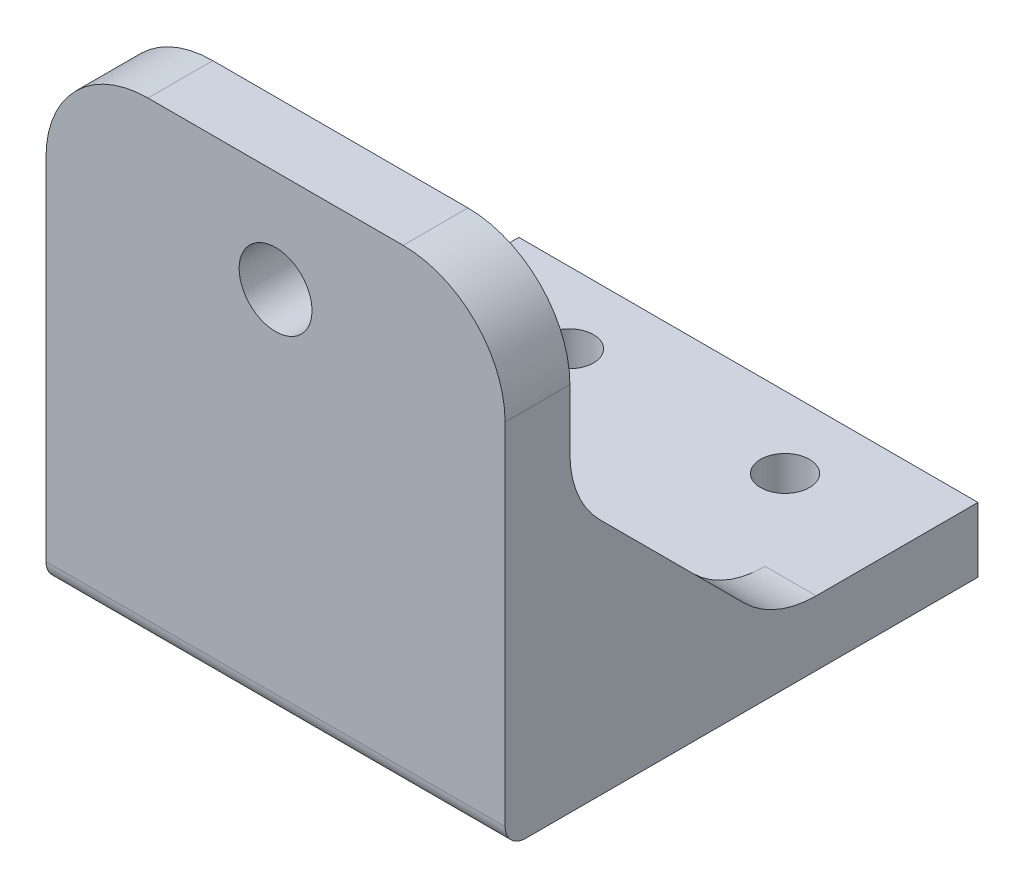
ISO-10303-21;
HEADER;
FILE_DESCRIPTION(('STEP AP214'),'2;1');
FILE_NAME('part.step','',(''),(''),'','','');
FILE_SCHEMA(('AUTOMOTIVE_DESIGN { 1 0 10303 214 1 1 1 1 }'));
ENDSEC;
DATA;
#1=APPLICATION_CONTEXT('core data for automotive mechanical design processes');
#2=APPLICATION_PROTOCOL_DEFINITION('international standard','automotive_design',2000,#1);
#3=PRODUCT_CONTEXT('',#1,'mechanical');
#4=PRODUCT('Part','Part','',(#3));
#5=PRODUCT_RELATED_PRODUCT_CATEGORY('part','',(#4));
#6=PRODUCT_DEFINITION_FORMATION('','',#4);
#7=PRODUCT_DEFINITION_CONTEXT('part definition',#1,'design');
#8=PRODUCT_DEFINITION('design','',#6,#7);
#9=PRODUCT_DEFINITION_SHAPE('','',#8);
#10=(LENGTH_UNIT() NAMED_UNIT(*) SI_UNIT(.MILLI.,.METRE.));
#11=(NAMED_UNIT(*) PLANE_ANGLE_UNIT() SI_UNIT($,.RADIAN.));
#12=(NAMED_UNIT(*) SI_UNIT($,.STERADIAN.) SOLID_ANGLE_UNIT());
#13=UNCERTAINTY_MEASURE_WITH_UNIT(LENGTH_MEASURE(1.E-05),#10,'distance_accuracy_value','');
#14=(GEOMETRIC_REPRESENTATION_CONTEXT(3) GLOBAL_UNCERTAINTY_ASSIGNED_CONTEXT((#13)) GLOBAL_UNIT_ASSIGNED_CONTEXT((#10,
#11,#12)) REPRESENTATION_CONTEXT('',''));
#15=CARTESIAN_POINT('',(0.,0.,0.));
#16=DIRECTION('',(0.,0.,1.));
#17=DIRECTION('',(1.,0.,0.));
#18=AXIS2_PLACEMENT_3D('',#15,#16,#17);
#19=CARTESIAN_POINT('',(0.,6.35,0.));
#20=DIRECTION('',(0.,1.,0.));
#21=DIRECTION('',(0.,0.,1.));
#22=AXIS2_PLACEMENT_3D('',#19,#20,#21);
#23=PLANE('',#22);
#24=CARTESIAN_POINT('',(-10.58478565,6.35,44.5));
#25=DIRECTION('',(0.,1.,0.));
#26=DIRECTION('',(0.,0.,1.));
#27=AXIS2_PLACEMENT_3D('',#24,#25,#26);
#28=CIRCLE('',#27,2.39999999999999);
#29=CARTESIAN_POINT('',(-10.58478565,6.35,46.9));
#30=VERTEX_POINT('',#29);
#31=EDGE_CURVE('E420',#30,#30,#28,.T.);
#32=ORIENTED_EDGE('',*,*,#31,.F.);
#33=EDGE_LOOP('',(#32));
#34=FACE_BOUND('',#33,.T.);
#35=CARTESIAN_POINT('',(10.58478565,6.35,44.5));
#36=DIRECTION('',(0.,1.,0.));
#37=DIRECTION('',(0.,0.,1.));
#38=AXIS2_PLACEMENT_3D('',#35,#36,#37);
#39=CIRCLE('',#38,2.39999999999999);
#40=CARTESIAN_POINT('',(10.58478565,6.35,46.9));
#41=VERTEX_POINT('',#40);
#42=EDGE_CURVE('E357',#41,#41,#39,.T.);
#43=ORIENTED_EDGE('',*,*,#42,.F.);
#44=EDGE_LOOP('',(#43));
#45=FACE_BOUND('',#44,.T.);
#46=DIRECTION('',(0.,0.,1.));
#47=VECTOR('',#46,1.);
#48=CARTESIAN_POINT('',(17.5,6.35,57.5));
#49=LINE('',#48,#47);
#50=CARTESIAN_POINT('',(17.5,6.35,53.357864376269));
#51=VERTEX_POINT('',#50);
#52=CARTESIAN_POINT('',(17.5,6.35,75.5));
#53=VERTEX_POINT('',#52);
#54=EDGE_CURVE('E168',#51,#53,#49,.T.);
#55=ORIENTED_EDGE('',*,*,#54,.F.);
#56=DIRECTION('',(1.,0.,0.));
#57=VECTOR('',#56,1.);
#58=CARTESIAN_POINT('',(0.,6.35,53.357864376269));
#59=LINE('',#58,#57);
#60=CARTESIAN_POINT('',(22.5,6.35,53.357864376269));
#61=VERTEX_POINT('',#60);
#62=EDGE_CURVE('E174',#51,#61,#59,.T.);
#63=ORIENTED_EDGE('',*,*,#62,.T.);
#64=DIRECTION('',(0.,0.,-1.));
#65=VECTOR('',#64,1.);
#66=CARTESIAN_POINT('',(22.5,6.35,77.5));
#67=LINE('',#66,#65);
#68=CARTESIAN_POINT('',(22.5,6.35,37.5));
#69=VERTEX_POINT('',#68);
#70=EDGE_CURVE('E259',#61,#69,#67,.T.);
#71=ORIENTED_EDGE('',*,*,#70,.T.);
#72=DIRECTION('',(-1.,0.,0.));
#73=VECTOR('',#72,1.);
#74=CARTESIAN_POINT('',(0.,6.35,37.5));
#75=LINE('',#74,#73);
#76=CARTESIAN_POINT('',(-22.5,6.35,37.5));
#77=VERTEX_POINT('',#76);
#78=EDGE_CURVE('E351',#69,#77,#75,.T.);
#79=ORIENTED_EDGE('',*,*,#78,.T.);
#80=DIRECTION('',(0.,0.,1.));
#81=VECTOR('',#80,1.);
#82=CARTESIAN_POINT('',(-22.5,6.35,77.5));
#83=LINE('',#82,#81);
#84=CARTESIAN_POINT('',(-22.5,6.35,53.357864376269));
#85=VERTEX_POINT('',#84);
#86=EDGE_CURVE('E268',#77,#85,#83,.T.);
#87=ORIENTED_EDGE('',*,*,#86,.T.);
#88=DIRECTION('',(-1.,0.,0.));
#89=VECTOR('',#88,1.);
#90=CARTESIAN_POINT('',(-17.5,6.35,53.357864376269));
#91=LINE('',#90,#89);
#92=CARTESIAN_POINT('',(-17.5,6.35,53.357864376269));
#93=VERTEX_POINT('',#92);
#94=EDGE_CURVE('E210',#85,#93,#91,.F.);
#95=ORIENTED_EDGE('',*,*,#94,.T.);
#96=DIRECTION('',(0.,0.,1.));
#97=VECTOR('',#96,1.);
#98=CARTESIAN_POINT('',(-17.5,6.35,57.5));
#99=LINE('',#98,#97);
#100=CARTESIAN_POINT('',(-17.5,6.35,75.5));
#101=VERTEX_POINT('',#100);
#102=EDGE_CURVE('E405',#93,#101,#99,.T.);
#103=ORIENTED_EDGE('',*,*,#102,.T.);
#104=DIRECTION('',(1.,0.,0.));
#105=VECTOR('',#104,1.);
#106=CARTESIAN_POINT('',(0.,6.35,75.5));
#107=LINE('',#106,#105);
#108=EDGE_CURVE('E192',#101,#53,#107,.T.);
#109=ORIENTED_EDGE('',*,*,#108,.T.);
#110=EDGE_LOOP('',(#55,#63,#71,#79,#87,#95,#103,#109));
#111=FACE_BOUND('',#110,.T.);
#112=ADVANCED_FACE('F43',(#34,#45,#111),#23,.T.);
#113=CARTESIAN_POINT('',(0.,0.,77.5));
#114=DIRECTION('',(0.,0.,1.));
#115=DIRECTION('',(1.,0.,0.));
#116=AXIS2_PLACEMENT_3D('',#113,#114,#115);
#117=PLANE('',#116);
#118=CARTESIAN_POINT('',(0.,36.35,77.5));
#119=DIRECTION('',(0.,0.,-1.));
#120=DIRECTION('',(-1.,0.,0.));
#121=AXIS2_PLACEMENT_3D('',#118,#119,#120);
#122=CIRCLE('',#121,4.20624);
#123=CARTESIAN_POINT('',(-4.20624,36.35,77.5));
#124=VERTEX_POINT('',#123);
#125=EDGE_CURVE('E355',#124,#124,#122,.T.);
#126=ORIENTED_EDGE('',*,*,#125,.F.);
#127=EDGE_LOOP('',(#126));
#128=FACE_BOUND('',#127,.T.);
#129=DIRECTION('',(0.,1.,0.));
#130=VECTOR('',#129,1.);
#131=CARTESIAN_POINT('',(22.5,0.,77.5));
#132=LINE('',#131,#130);
#133=CARTESIAN_POINT('',(22.5,30.492135623731,77.5));
#134=VERTEX_POINT('',#133);
#135=CARTESIAN_POINT('',(22.5,36.35,77.5));
#136=VERTEX_POINT('',#135);
#137=EDGE_CURVE('E372',#134,#136,#132,.T.);
#138=ORIENTED_EDGE('',*,*,#137,.F.);
#139=DIRECTION('',(1.,0.,0.));
#140=VECTOR('',#139,1.);
#141=CARTESIAN_POINT('',(17.5,30.492135623731,77.5));
#142=LINE('',#141,#140);
#143=CARTESIAN_POINT('',(17.5,30.492135623731,77.5));
#144=VERTEX_POINT('',#143);
#145=EDGE_CURVE('E182',#134,#144,#142,.F.);
#146=ORIENTED_EDGE('',*,*,#145,.T.);
#147=DIRECTION('',(0.,1.,0.));
#148=VECTOR('',#147,1.);
#149=CARTESIAN_POINT('',(17.5,6.35,77.5));
#150=LINE('',#149,#148);
#151=CARTESIAN_POINT('',(17.5,8.35,77.5));
#152=VERTEX_POINT('',#151);
#153=EDGE_CURVE('E58',#152,#144,#150,.T.);
#154=ORIENTED_EDGE('',*,*,#153,.F.);
#155=DIRECTION('',(1.,0.,0.));
#156=VECTOR('',#155,1.);
#157=CARTESIAN_POINT('',(0.,8.35,77.5));
#158=LINE('',#157,#156);
#159=CARTESIAN_POINT('',(-17.5,8.35,77.5));
#160=VERTEX_POINT('',#159);
#161=EDGE_CURVE('E179',#152,#160,#158,.F.);
#162=ORIENTED_EDGE('',*,*,#161,.T.);
#163=DIRECTION('',(0.,1.,0.));
#164=VECTOR('',#163,1.);
#165=CARTESIAN_POINT('',(-17.5,6.35,77.5));
#166=LINE('',#165,#164);
#167=CARTESIAN_POINT('',(-17.5,30.492135623731,77.5));
#168=VERTEX_POINT('',#167);
#169=EDGE_CURVE('E389',#160,#168,#166,.T.);
#170=ORIENTED_EDGE('',*,*,#169,.T.);
#171=DIRECTION('',(-1.,0.,0.));
#172=VECTOR('',#171,1.);
#173=CARTESIAN_POINT('',(0.,30.492135623731,77.5));
#174=LINE('',#173,#172);
#175=CARTESIAN_POINT('',(-22.5,30.492135623731,77.5));
#176=VERTEX_POINT('',#175);
#177=EDGE_CURVE('E214',#168,#176,#174,.T.);
#178=ORIENTED_EDGE('',*,*,#177,.T.);
#179=DIRECTION('',(0.,-1.,0.));
#180=VECTOR('',#179,1.);
#181=CARTESIAN_POINT('',(-22.5,0.,77.5));
#182=LINE('',#181,#180);
#183=CARTESIAN_POINT('',(-22.5,36.35,77.5));
#184=VERTEX_POINT('',#183);
#185=EDGE_CURVE('E375',#184,#176,#182,.T.);
#186=ORIENTED_EDGE('',*,*,#185,.F.);
#187=CARTESIAN_POINT('',(-12.5,36.35,77.5));
#188=DIRECTION('',(0.,0.,1.));
#189=DIRECTION('',(1.,0.,0.));
#190=AXIS2_PLACEMENT_3D('',#187,#188,#189);
#191=CIRCLE('',#190,10.);
#192=CARTESIAN_POINT('',(-12.5,46.35,77.5));
#193=VERTEX_POINT('',#192);
#194=EDGE_CURVE('E289',#184,#193,#191,.F.);
#195=ORIENTED_EDGE('',*,*,#194,.T.);
#196=DIRECTION('',(-1.,0.,0.));
#197=VECTOR('',#196,1.);
#198=CARTESIAN_POINT('',(22.5,46.35,77.5));
#199=LINE('',#198,#197);
#200=CARTESIAN_POINT('',(12.5,46.35,77.5));
#201=VERTEX_POINT('',#200);
#202=EDGE_CURVE('E380',#201,#193,#199,.T.);
#203=ORIENTED_EDGE('',*,*,#202,.F.);
#204=CARTESIAN_POINT('',(12.5,36.35,77.5));
#205=DIRECTION('',(0.,0.,1.));
#206=DIRECTION('',(1.,0.,0.));
#207=AXIS2_PLACEMENT_3D('',#204,#205,#206);
#208=CIRCLE('',#207,10.);
#209=EDGE_CURVE('E273',#201,#136,#208,.F.);
#210=ORIENTED_EDGE('',*,*,#209,.T.);
#211=EDGE_LOOP('',(#138,#146,#154,#162,#170,#178,#186,#195,#203,#210));
#212=FACE_BOUND('',#211,.T.);
#213=ADVANCED_FACE('F178',(#128,#212),#117,.F.);
#214=CARTESIAN_POINT('',(-22.5,6.35,77.5));
#215=DIRECTION('',(1.,0.,0.));
#216=DIRECTION('',(0.,0.,-1.));
#217=AXIS2_PLACEMENT_3D('',#214,#215,#216);
#218=PLANE('',#217);
#219=ORIENTED_EDGE('',*,*,#185,.T.);
#220=CARTESIAN_POINT('',(-22.5,30.492135623731,67.5));
#221=DIRECTION('',(1.,0.,0.));
#222=DIRECTION('',(0.,0.,-1.));
#223=AXIS2_PLACEMENT_3D('',#220,#221,#222);
#224=CIRCLE('',#223,10.);
#225=CARTESIAN_POINT('',(-22.5,23.4210678118655,74.5710678118655));
#226=VERTEX_POINT('',#225);
#227=EDGE_CURVE('E224',#176,#226,#224,.T.);
#228=ORIENTED_EDGE('',*,*,#227,.T.);
#229=DIRECTION('',(0.,-0.707106781186547,-0.707106781186548));
#230=VECTOR('',#229,1.);
#231=CARTESIAN_POINT('',(-22.5,26.35,77.5));
#232=LINE('',#231,#230);
#233=CARTESIAN_POINT('',(-22.5,9.27893218813452,60.4289321881345));
#234=VERTEX_POINT('',#233);
#235=EDGE_CURVE('E400',#226,#234,#232,.T.);
#236=ORIENTED_EDGE('',*,*,#235,.T.);
#237=CARTESIAN_POINT('',(-22.5,16.35,53.357864376269));
#238=DIRECTION('',(1.,0.,0.));
#239=DIRECTION('',(0.,0.,-1.));
#240=AXIS2_PLACEMENT_3D('',#237,#238,#239);
#241=CIRCLE('',#240,10.);
#242=EDGE_CURVE('E218',#234,#85,#241,.T.);
#243=ORIENTED_EDGE('',*,*,#242,.T.);
#244=ORIENTED_EDGE('',*,*,#86,.F.);
#245=DIRECTION('',(0.,1.,0.));
#246=VECTOR('',#245,1.);
#247=CARTESIAN_POINT('',(-22.5,6.35,37.5));
#248=LINE('',#247,#246);
#249=CARTESIAN_POINT('',(-22.5,0.,37.5));
#250=VERTEX_POINT('',#249);
#251=EDGE_CURVE('E348',#250,#77,#248,.T.);
#252=ORIENTED_EDGE('',*,*,#251,.F.);
#253=DIRECTION('',(0.,0.,1.));
#254=VECTOR('',#253,1.);
#255=CARTESIAN_POINT('',(-22.5,0.,77.5));
#256=LINE('',#255,#254);
#257=CARTESIAN_POINT('',(-22.5,0.,81.85));
#258=VERTEX_POINT('',#257);
#259=EDGE_CURVE('E280',#250,#258,#256,.T.);
#260=ORIENTED_EDGE('',*,*,#259,.T.);
#261=CARTESIAN_POINT('',(-22.5,2.,81.85));
#262=DIRECTION('',(1.,0.,0.));
#263=DIRECTION('',(0.,0.,-1.));
#264=AXIS2_PLACEMENT_3D('',#261,#262,#263);
#265=CIRCLE('',#264,2.);
#266=CARTESIAN_POINT('',(-22.5,2.,83.85));
#267=VERTEX_POINT('',#266);
#268=EDGE_CURVE('E197',#258,#267,#265,.F.);
#269=ORIENTED_EDGE('',*,*,#268,.T.);
#270=DIRECTION('',(0.,-1.,0.));
#271=VECTOR('',#270,1.);
#272=CARTESIAN_POINT('',(-22.5,0.,83.85));
#273=LINE('',#272,#271);
#274=CARTESIAN_POINT('',(-22.5,36.35,83.85));
#275=VERTEX_POINT('',#274);
#276=EDGE_CURVE('E283',#275,#267,#273,.T.);
#277=ORIENTED_EDGE('',*,*,#276,.F.);
#278=DIRECTION('',(0.,0.,-1.));
#279=VECTOR('',#278,1.);
#280=CARTESIAN_POINT('',(-22.5,36.35,77.5));
#281=LINE('',#280,#279);
#282=EDGE_CURVE('E267',#275,#184,#281,.T.);
#283=ORIENTED_EDGE('',*,*,#282,.T.);
#284=EDGE_LOOP('',(#219,#228,#236,#243,#244,#252,#260,#269,#277,#283));
#285=FACE_BOUND('',#284,.T.);
#286=ADVANCED_FACE('F325',(#285),#218,.F.);
#287=CARTESIAN_POINT('',(22.5,6.35,77.5));
#288=DIRECTION('',(-1.,0.,0.));
#289=DIRECTION('',(0.,0.,1.));
#290=AXIS2_PLACEMENT_3D('',#287,#288,#289);
#291=PLANE('',#290);
#292=ORIENTED_EDGE('',*,*,#70,.F.);
#293=CARTESIAN_POINT('',(22.5,16.35,53.357864376269));
#294=DIRECTION('',(-1.,0.,0.));
#295=DIRECTION('',(0.,0.,1.));
#296=AXIS2_PLACEMENT_3D('',#293,#294,#295);
#297=CIRCLE('',#296,10.);
#298=CARTESIAN_POINT('',(22.5,9.27893218813452,60.4289321881345));
#299=VERTEX_POINT('',#298);
#300=EDGE_CURVE('E242',#61,#299,#297,.T.);
#301=ORIENTED_EDGE('',*,*,#300,.T.);
#302=DIRECTION('',(0.,-0.707106781186547,-0.707106781186548));
#303=VECTOR('',#302,1.);
#304=CARTESIAN_POINT('',(22.5,26.35,77.5));
#305=LINE('',#304,#303);
#306=CARTESIAN_POINT('',(22.5,23.4210678118655,74.5710678118655));
#307=VERTEX_POINT('',#306);
#308=EDGE_CURVE('E185',#307,#299,#305,.T.);
#309=ORIENTED_EDGE('',*,*,#308,.F.);
#310=CARTESIAN_POINT('',(22.5,30.492135623731,67.5));
#311=DIRECTION('',(-1.,0.,0.));
#312=DIRECTION('',(0.,0.,1.));
#313=AXIS2_PLACEMENT_3D('',#310,#311,#312);
#314=CIRCLE('',#313,10.);
#315=EDGE_CURVE('E52',#307,#134,#314,.T.);
#316=ORIENTED_EDGE('',*,*,#315,.T.);
#317=ORIENTED_EDGE('',*,*,#137,.T.);
#318=DIRECTION('',(0.,0.,-1.));
#319=VECTOR('',#318,1.);
#320=CARTESIAN_POINT('',(22.5,36.35,77.5));
#321=LINE('',#320,#319);
#322=CARTESIAN_POINT('',(22.5,36.35,83.85));
#323=VERTEX_POINT('',#322);
#324=EDGE_CURVE('E305',#136,#323,#321,.F.);
#325=ORIENTED_EDGE('',*,*,#324,.T.);
#326=DIRECTION('',(0.,1.,0.));
#327=VECTOR('',#326,1.);
#328=CARTESIAN_POINT('',(22.5,0.,83.85));
#329=LINE('',#328,#327);
#330=CARTESIAN_POINT('',(22.5,2.,83.85));
#331=VERTEX_POINT('',#330);
#332=EDGE_CURVE('E342',#331,#323,#329,.T.);
#333=ORIENTED_EDGE('',*,*,#332,.F.);
#334=CARTESIAN_POINT('',(22.5,2.,81.85));
#335=DIRECTION('',(-1.,0.,0.));
#336=DIRECTION('',(0.,0.,1.));
#337=AXIS2_PLACEMENT_3D('',#334,#335,#336);
#338=CIRCLE('',#337,2.);
#339=CARTESIAN_POINT('',(22.5,0.,81.85));
#340=VERTEX_POINT('',#339);
#341=EDGE_CURVE('E313',#331,#340,#338,.F.);
#342=ORIENTED_EDGE('',*,*,#341,.T.);
#343=DIRECTION('',(0.,0.,-1.));
#344=VECTOR('',#343,1.);
#345=CARTESIAN_POINT('',(22.5,0.,77.5));
#346=LINE('',#345,#344);
#347=CARTESIAN_POINT('',(22.5,0.,37.5));
#348=VERTEX_POINT('',#347);
#349=EDGE_CURVE('E276',#340,#348,#346,.T.);
#350=ORIENTED_EDGE('',*,*,#349,.T.);
#351=DIRECTION('',(0.,-1.,0.));
#352=VECTOR('',#351,1.);
#353=CARTESIAN_POINT('',(22.5,6.35,37.5));
#354=LINE('',#353,#352);
#355=EDGE_CURVE('E265',#69,#348,#354,.T.);
#356=ORIENTED_EDGE('',*,*,#355,.F.);
#357=EDGE_LOOP('',(#292,#301,#309,#316,#317,#325,#333,#342,#350,#356));
#358=FACE_BOUND('',#357,.T.);
#359=ADVANCED_FACE('F262',(#358),#291,.F.);
#360=CARTESIAN_POINT('',(0.,0.,0.));
#361=DIRECTION('',(0.,1.,0.));
#362=DIRECTION('',(0.,0.,1.));
#363=AXIS2_PLACEMENT_3D('',#360,#361,#362);
#364=PLANE('',#363);
#365=CARTESIAN_POINT('',(-10.58478565,0.,44.5));
#366=DIRECTION('',(0.,-1.,0.));
#367=DIRECTION('',(0.,0.,-1.));
#368=AXIS2_PLACEMENT_3D('',#365,#366,#367);
#369=CIRCLE('',#368,2.4);
#370=CARTESIAN_POINT('',(-10.58478565,0.,42.1));
#371=VERTEX_POINT('',#370);
#372=EDGE_CURVE('E410',#371,#371,#369,.T.);
#373=ORIENTED_EDGE('',*,*,#372,.F.);
#374=EDGE_LOOP('',(#373));
#375=FACE_BOUND('',#374,.T.);
#376=CARTESIAN_POINT('',(10.58478565,0.,44.5));
#377=DIRECTION('',(0.,-1.,0.));
#378=DIRECTION('',(0.,0.,-1.));
#379=AXIS2_PLACEMENT_3D('',#376,#377,#378);
#380=CIRCLE('',#379,2.4);
#381=CARTESIAN_POINT('',(10.58478565,0.,42.1));
#382=VERTEX_POINT('',#381);
#383=EDGE_CURVE('E424',#382,#382,#380,.T.);
#384=ORIENTED_EDGE('',*,*,#383,.F.);
#385=EDGE_LOOP('',(#384));
#386=FACE_BOUND('',#385,.T.);
#387=DIRECTION('',(-1.,0.,0.));
#388=VECTOR('',#387,1.);
#389=CARTESIAN_POINT('',(0.,0.,37.5));
#390=LINE('',#389,#388);
#391=EDGE_CURVE('E191',#348,#250,#390,.T.);
#392=ORIENTED_EDGE('',*,*,#391,.F.);
#393=ORIENTED_EDGE('',*,*,#349,.F.);
#394=DIRECTION('',(1.,0.,0.));
#395=VECTOR('',#394,1.);
#396=CARTESIAN_POINT('',(-22.5,0.,81.85));
#397=LINE('',#396,#395);
#398=EDGE_CURVE('E316',#340,#258,#397,.F.);
#399=ORIENTED_EDGE('',*,*,#398,.T.);
#400=ORIENTED_EDGE('',*,*,#259,.F.);
#401=EDGE_LOOP('',(#392,#393,#399,#400));
#402=FACE_BOUND('',#401,.T.);
#403=ADVANCED_FACE('F345',(#375,#386,#402),#364,.F.);
#404=CARTESIAN_POINT('',(22.5,46.35,83.85));
#405=DIRECTION('',(0.,-1.,0.));
#406=DIRECTION('',(1.,0.,0.));
#407=AXIS2_PLACEMENT_3D('',#404,#405,#406);
#408=PLANE('',#407);
#409=ORIENTED_EDGE('',*,*,#202,.T.);
#410=DIRECTION('',(0.,0.,-1.));
#411=VECTOR('',#410,1.);
#412=CARTESIAN_POINT('',(-12.5,46.35,83.85));
#413=LINE('',#412,#411);
#414=CARTESIAN_POINT('',(-12.5,46.35,83.85));
#415=VERTEX_POINT('',#414);
#416=EDGE_CURVE('E296',#193,#415,#413,.F.);
#417=ORIENTED_EDGE('',*,*,#416,.T.);
#418=DIRECTION('',(-1.,0.,0.));
#419=VECTOR('',#418,1.);
#420=CARTESIAN_POINT('',(22.5,46.35,83.85));
#421=LINE('',#420,#419);
#422=CARTESIAN_POINT('',(12.5,46.35,83.85));
#423=VERTEX_POINT('',#422);
#424=EDGE_CURVE('E338',#423,#415,#421,.T.);
#425=ORIENTED_EDGE('',*,*,#424,.F.);
#426=DIRECTION('',(0.,0.,-1.));
#427=VECTOR('',#426,1.);
#428=CARTESIAN_POINT('',(12.5,46.35,83.85));
#429=LINE('',#428,#427);
#430=EDGE_CURVE('E292',#423,#201,#429,.T.);
#431=ORIENTED_EDGE('',*,*,#430,.T.);
#432=EDGE_LOOP('',(#409,#417,#425,#431));
#433=FACE_BOUND('',#432,.T.);
#434=ADVANCED_FACE('F445',(#433),#408,.F.);
#435=CARTESIAN_POINT('',(0.,0.,83.85));
#436=DIRECTION('',(0.,0.,1.));
#437=DIRECTION('',(1.,0.,0.));
#438=AXIS2_PLACEMENT_3D('',#435,#436,#437);
#439=PLANE('',#438);
#440=CARTESIAN_POINT('',(0.,36.35,83.85));
#441=DIRECTION('',(0.,0.,-1.));
#442=DIRECTION('',(-1.,0.,0.));
#443=AXIS2_PLACEMENT_3D('',#440,#441,#442);
#444=CIRCLE('',#443,3.57123999999999);
#445=CARTESIAN_POINT('',(-3.57123999999999,36.35,83.85));
#446=VERTEX_POINT('',#445);
#447=EDGE_CURVE('E368',#446,#446,#444,.T.);
#448=ORIENTED_EDGE('',*,*,#447,.T.);
#449=EDGE_LOOP('',(#448));
#450=FACE_BOUND('',#449,.T.);
#451=ORIENTED_EDGE('',*,*,#276,.T.);
#452=DIRECTION('',(1.,0.,0.));
#453=VECTOR('',#452,1.);
#454=CARTESIAN_POINT('',(22.5,2.,83.85));
#455=LINE('',#454,#453);
#456=EDGE_CURVE('E309',#267,#331,#455,.T.);
#457=ORIENTED_EDGE('',*,*,#456,.T.);
#458=ORIENTED_EDGE('',*,*,#332,.T.);
#459=CARTESIAN_POINT('',(12.5,36.35,83.85));
#460=DIRECTION('',(0.,0.,1.));
#461=DIRECTION('',(1.,0.,0.));
#462=AXIS2_PLACEMENT_3D('',#459,#460,#461);
#463=CIRCLE('',#462,10.);
#464=EDGE_CURVE('E299',#323,#423,#463,.T.);
#465=ORIENTED_EDGE('',*,*,#464,.T.);
#466=ORIENTED_EDGE('',*,*,#424,.T.);
#467=CARTESIAN_POINT('',(-12.5,36.35,83.85));
#468=DIRECTION('',(0.,0.,1.));
#469=DIRECTION('',(1.,0.,0.));
#470=AXIS2_PLACEMENT_3D('',#467,#468,#469);
#471=CIRCLE('',#470,10.);
#472=EDGE_CURVE('E302',#415,#275,#471,.T.);
#473=ORIENTED_EDGE('',*,*,#472,.T.);
#474=EDGE_LOOP('',(#451,#457,#458,#465,#466,#473));
#475=FACE_BOUND('',#474,.T.);
#476=ADVANCED_FACE('F333',(#450,#475),#439,.T.);
#477=CARTESIAN_POINT('',(0.,36.35,77.5));
#478=DIRECTION('',(0.,0.,-1.));
#479=DIRECTION('',(-1.,0.,0.));
#480=AXIS2_PLACEMENT_3D('',#477,#478,#479);
#481=CYLINDRICAL_SURFACE('',#480,3.57124);
#482=ORIENTED_EDGE('',*,*,#447,.F.);
#483=EDGE_LOOP('',(#482));
#484=FACE_BOUND('',#483,.T.);
#485=CARTESIAN_POINT('',(0.,36.35,78.135));
#486=DIRECTION('',(0.,0.,-1.));
#487=DIRECTION('',(-1.,0.,0.));
#488=AXIS2_PLACEMENT_3D('',#485,#486,#487);
#489=CIRCLE('',#488,3.57124);
#490=CARTESIAN_POINT('',(-3.57124,36.35,78.135));
#491=VERTEX_POINT('',#490);
#492=EDGE_CURVE('E364',#491,#491,#489,.T.);
#493=ORIENTED_EDGE('',*,*,#492,.T.);
#494=EDGE_LOOP('',(#493));
#495=FACE_BOUND('',#494,.T.);
#496=ADVANCED_FACE('F499',(#484,#495),#481,.F.);
#497=CARTESIAN_POINT('',(0.,36.35,77.5));
#498=DIRECTION('',(0.,0.,-1.));
#499=DIRECTION('',(-1.,0.,0.));
#500=AXIS2_PLACEMENT_3D('',#497,#498,#499);
#501=CONICAL_SURFACE('',#500,4.20624,0.785398163397453);
#502=ORIENTED_EDGE('',*,*,#492,.F.);
#503=EDGE_LOOP('',(#502));
#504=FACE_BOUND('',#503,.T.);
#505=ORIENTED_EDGE('',*,*,#125,.T.);
#506=EDGE_LOOP('',(#505));
#507=FACE_BOUND('',#506,.T.);
#508=ADVANCED_FACE('F457',(#504,#507),#501,.F.);
#509=CARTESIAN_POINT('',(-12.5,36.35,77.5));
#510=DIRECTION('',(0.,0.,-1.));
#511=DIRECTION('',(-1.,0.,0.));
#512=AXIS2_PLACEMENT_3D('',#509,#510,#511);
#513=CYLINDRICAL_SURFACE('',#512,10.);
#514=ORIENTED_EDGE('',*,*,#472,.F.);
#515=ORIENTED_EDGE('',*,*,#416,.F.);
#516=ORIENTED_EDGE('',*,*,#194,.F.);
#517=ORIENTED_EDGE('',*,*,#282,.F.);
#518=EDGE_LOOP('',(#514,#515,#516,#517));
#519=FACE_BOUND('',#518,.T.);
#520=ADVANCED_FACE('F453',(#519),#513,.T.);
#521=CARTESIAN_POINT('',(12.5,36.35,83.85));
#522=DIRECTION('',(0.,0.,-1.));
#523=DIRECTION('',(-1.,0.,0.));
#524=AXIS2_PLACEMENT_3D('',#521,#522,#523);
#525=CYLINDRICAL_SURFACE('',#524,10.);
#526=ORIENTED_EDGE('',*,*,#464,.F.);
#527=ORIENTED_EDGE('',*,*,#324,.F.);
#528=ORIENTED_EDGE('',*,*,#209,.F.);
#529=ORIENTED_EDGE('',*,*,#430,.F.);
#530=EDGE_LOOP('',(#526,#527,#528,#529));
#531=FACE_BOUND('',#530,.T.);
#532=ADVANCED_FACE('F456',(#531),#525,.T.);
#533=CARTESIAN_POINT('',(0.,2.,81.85));
#534=DIRECTION('',(-1.,0.,0.));
#535=DIRECTION('',(0.,0.,1.));
#536=AXIS2_PLACEMENT_3D('',#533,#534,#535);
#537=CYLINDRICAL_SURFACE('',#536,2.);
#538=ORIENTED_EDGE('',*,*,#268,.F.);
#539=ORIENTED_EDGE('',*,*,#398,.F.);
#540=ORIENTED_EDGE('',*,*,#341,.F.);
#541=ORIENTED_EDGE('',*,*,#456,.F.);
#542=EDGE_LOOP('',(#538,#539,#540,#541));
#543=FACE_BOUND('',#542,.T.);
#544=ADVANCED_FACE('F340',(#543),#537,.T.);
#545=CARTESIAN_POINT('',(0.,8.35,75.5));
#546=DIRECTION('',(1.,0.,0.));
#547=DIRECTION('',(0.,0.,-1.));
#548=AXIS2_PLACEMENT_3D('',#545,#546,#547);
#549=CYLINDRICAL_SURFACE('',#548,2.);
#550=ORIENTED_EDGE('',*,*,#161,.F.);
#551=CARTESIAN_POINT('',(17.5,8.35,75.5));
#552=DIRECTION('',(-1.,0.,0.));
#553=DIRECTION('',(0.,0.,1.));
#554=AXIS2_PLACEMENT_3D('',#551,#552,#553);
#555=CIRCLE('',#554,2.);
#556=EDGE_CURVE('E165',#152,#53,#555,.F.);
#557=ORIENTED_EDGE('',*,*,#556,.T.);
#558=ORIENTED_EDGE('',*,*,#108,.F.);
#559=CARTESIAN_POINT('',(-17.5,8.35,75.5));
#560=DIRECTION('',(1.,0.,0.));
#561=DIRECTION('',(0.,0.,-1.));
#562=AXIS2_PLACEMENT_3D('',#559,#560,#561);
#563=CIRCLE('',#562,2.);
#564=EDGE_CURVE('E189',#101,#160,#563,.F.);
#565=ORIENTED_EDGE('',*,*,#564,.T.);
#566=EDGE_LOOP('',(#550,#557,#558,#565));
#567=FACE_BOUND('',#566,.T.);
#568=ADVANCED_FACE('F188',(#567),#549,.F.);
#569=CARTESIAN_POINT('',(0.,0.,37.5));
#570=DIRECTION('',(0.,0.,-1.));
#571=DIRECTION('',(-1.,0.,0.));
#572=AXIS2_PLACEMENT_3D('',#569,#570,#571);
#573=PLANE('',#572);
#574=ORIENTED_EDGE('',*,*,#355,.T.);
#575=ORIENTED_EDGE('',*,*,#391,.T.);
#576=ORIENTED_EDGE('',*,*,#251,.T.);
#577=ORIENTED_EDGE('',*,*,#78,.F.);
#578=EDGE_LOOP('',(#574,#575,#576,#577));
#579=FACE_BOUND('',#578,.T.);
#580=ADVANCED_FACE('F347',(#579),#573,.T.);
#581=CARTESIAN_POINT('',(10.58478565,0.,44.5));
#582=DIRECTION('',(0.,-1.,0.));
#583=DIRECTION('',(0.,0.,-1.));
#584=AXIS2_PLACEMENT_3D('',#581,#582,#583);
#585=CYLINDRICAL_SURFACE('',#584,2.39999999999999);
#586=ORIENTED_EDGE('',*,*,#42,.T.);
#587=EDGE_LOOP('',(#586));
#588=FACE_BOUND('',#587,.T.);
#589=ORIENTED_EDGE('',*,*,#383,.T.);
#590=EDGE_LOOP('',(#589));
#591=FACE_BOUND('',#590,.T.);
#592=ADVANCED_FACE('F431',(#588,#591),#585,.F.);
#593=CARTESIAN_POINT('',(-10.58478565,0.,44.5));
#594=DIRECTION('',(0.,-1.,0.));
#595=DIRECTION('',(0.,0.,-1.));
#596=AXIS2_PLACEMENT_3D('',#593,#594,#595);
#597=CYLINDRICAL_SURFACE('',#596,2.39999999999999);
#598=ORIENTED_EDGE('',*,*,#31,.T.);
#599=EDGE_LOOP('',(#598));
#600=FACE_BOUND('',#599,.T.);
#601=ORIENTED_EDGE('',*,*,#372,.T.);
#602=EDGE_LOOP('',(#601));
#603=FACE_BOUND('',#602,.T.);
#604=ADVANCED_FACE('F487',(#600,#603),#597,.F.);
#605=CARTESIAN_POINT('',(-17.5,0.,0.));
#606=DIRECTION('',(1.,0.,0.));
#607=DIRECTION('',(0.,0.,-1.));
#608=AXIS2_PLACEMENT_3D('',#605,#606,#607);
#609=PLANE('',#608);
#610=ORIENTED_EDGE('',*,*,#564,.F.);
#611=ORIENTED_EDGE('',*,*,#102,.F.);
#612=CARTESIAN_POINT('',(-17.5,16.35,53.357864376269));
#613=DIRECTION('',(1.,0.,0.));
#614=DIRECTION('',(0.,0.,-1.));
#615=AXIS2_PLACEMENT_3D('',#612,#613,#614);
#616=CIRCLE('',#615,10.);
#617=CARTESIAN_POINT('',(-17.5,9.27893218813452,60.4289321881345));
#618=VERTEX_POINT('',#617);
#619=EDGE_CURVE('E221',#93,#618,#616,.F.);
#620=ORIENTED_EDGE('',*,*,#619,.T.);
#621=DIRECTION('',(0.,-0.707106781186547,-0.707106781186548));
#622=VECTOR('',#621,1.);
#623=CARTESIAN_POINT('',(-17.5,26.35,77.5));
#624=LINE('',#623,#622);
#625=CARTESIAN_POINT('',(-17.5,23.4210678118655,74.5710678118655));
#626=VERTEX_POINT('',#625);
#627=EDGE_CURVE('E398',#626,#618,#624,.T.);
#628=ORIENTED_EDGE('',*,*,#627,.F.);
#629=CARTESIAN_POINT('',(-17.5,30.492135623731,67.5));
#630=DIRECTION('',(1.,0.,0.));
#631=DIRECTION('',(0.,0.,-1.));
#632=AXIS2_PLACEMENT_3D('',#629,#630,#631);
#633=CIRCLE('',#632,10.);
#634=EDGE_CURVE('E175',#626,#168,#633,.F.);
#635=ORIENTED_EDGE('',*,*,#634,.T.);
#636=ORIENTED_EDGE('',*,*,#169,.F.);
#637=EDGE_LOOP('',(#610,#611,#620,#628,#635,#636));
#638=FACE_BOUND('',#637,.T.);
#639=ADVANCED_FACE('F402',(#638),#609,.T.);
#640=CARTESIAN_POINT('',(-17.5,26.35,77.5));
#641=DIRECTION('',(0.,0.707106781186548,-0.707106781186547));
#642=DIRECTION('',(0.,0.707106781186547,0.707106781186548));
#643=AXIS2_PLACEMENT_3D('',#640,#641,#642);
#644=PLANE('',#643);
#645=ORIENTED_EDGE('',*,*,#627,.T.);
#646=DIRECTION('',(-1.,0.,0.));
#647=VECTOR('',#646,1.);
#648=CARTESIAN_POINT('',(-22.5,9.27893218813452,60.4289321881345));
#649=LINE('',#648,#647);
#650=EDGE_CURVE('E206',#618,#234,#649,.T.);
#651=ORIENTED_EDGE('',*,*,#650,.T.);
#652=ORIENTED_EDGE('',*,*,#235,.F.);
#653=DIRECTION('',(-1.,0.,0.));
#654=VECTOR('',#653,1.);
#655=CARTESIAN_POINT('',(-17.5,23.4210678118655,74.5710678118655));
#656=LINE('',#655,#654);
#657=EDGE_CURVE('E203',#226,#626,#656,.F.);
#658=ORIENTED_EDGE('',*,*,#657,.T.);
#659=EDGE_LOOP('',(#645,#651,#652,#658));
#660=FACE_BOUND('',#659,.T.);
#661=ADVANCED_FACE('F397',(#660),#644,.T.);
#662=CARTESIAN_POINT('',(-17.5,16.35,53.357864376269));
#663=DIRECTION('',(1.,0.,0.));
#664=DIRECTION('',(0.,0.,-1.));
#665=AXIS2_PLACEMENT_3D('',#662,#663,#664);
#666=CYLINDRICAL_SURFACE('',#665,10.);
#667=ORIENTED_EDGE('',*,*,#619,.F.);
#668=ORIENTED_EDGE('',*,*,#94,.F.);
#669=ORIENTED_EDGE('',*,*,#242,.F.);
#670=ORIENTED_EDGE('',*,*,#650,.F.);
#671=EDGE_LOOP('',(#667,#668,#669,#670));
#672=FACE_BOUND('',#671,.T.);
#673=ADVANCED_FACE('F466',(#672),#666,.F.);
#674=CARTESIAN_POINT('',(0.,30.492135623731,67.5));
#675=DIRECTION('',(-1.,0.,0.));
#676=DIRECTION('',(0.,0.,1.));
#677=AXIS2_PLACEMENT_3D('',#674,#675,#676);
#678=CYLINDRICAL_SURFACE('',#677,10.);
#679=ORIENTED_EDGE('',*,*,#634,.F.);
#680=ORIENTED_EDGE('',*,*,#657,.F.);
#681=ORIENTED_EDGE('',*,*,#227,.F.);
#682=ORIENTED_EDGE('',*,*,#177,.F.);
#683=EDGE_LOOP('',(#679,#680,#681,#682));
#684=FACE_BOUND('',#683,.T.);
#685=ADVANCED_FACE('F392',(#684),#678,.F.);
#686=CARTESIAN_POINT('',(17.5,0.,0.));
#687=DIRECTION('',(-1.,0.,0.));
#688=DIRECTION('',(0.,0.,-1.));
#689=AXIS2_PLACEMENT_3D('',#686,#687,#688);
#690=PLANE('',#689);
#691=ORIENTED_EDGE('',*,*,#556,.F.);
#692=ORIENTED_EDGE('',*,*,#153,.T.);
#693=CARTESIAN_POINT('',(17.5,30.492135623731,67.5));
#694=DIRECTION('',(-1.,0.,0.));
#695=DIRECTION('',(0.,0.,1.));
#696=AXIS2_PLACEMENT_3D('',#693,#694,#695);
#697=CIRCLE('',#696,10.);
#698=CARTESIAN_POINT('',(17.5,23.4210678118655,74.5710678118655));
#699=VERTEX_POINT('',#698);
#700=EDGE_CURVE('E11',#144,#699,#697,.F.);
#701=ORIENTED_EDGE('',*,*,#700,.T.);
#702=DIRECTION('',(0.,-0.707106781186547,-0.707106781186548));
#703=VECTOR('',#702,1.);
#704=CARTESIAN_POINT('',(17.5,26.35,77.5));
#705=LINE('',#704,#703);
#706=CARTESIAN_POINT('',(17.5,9.27893218813452,60.4289321881345));
#707=VERTEX_POINT('',#706);
#708=EDGE_CURVE('E252',#699,#707,#705,.T.);
#709=ORIENTED_EDGE('',*,*,#708,.T.);
#710=CARTESIAN_POINT('',(17.5,16.35,53.357864376269));
#711=DIRECTION('',(-1.,0.,0.));
#712=DIRECTION('',(0.,0.,1.));
#713=AXIS2_PLACEMENT_3D('',#710,#711,#712);
#714=CIRCLE('',#713,10.);
#715=EDGE_CURVE('E245',#707,#51,#714,.F.);
#716=ORIENTED_EDGE('',*,*,#715,.T.);
#717=ORIENTED_EDGE('',*,*,#54,.T.);
#718=EDGE_LOOP('',(#691,#692,#701,#709,#716,#717));
#719=FACE_BOUND('',#718,.T.);
#720=ADVANCED_FACE('F166',(#719),#690,.T.);
#721=CARTESIAN_POINT('',(17.5,26.35,77.5));
#722=DIRECTION('',(0.,-0.707106781186548,0.707106781186547));
#723=DIRECTION('',(0.,-0.707106781186547,-0.707106781186548));
#724=AXIS2_PLACEMENT_3D('',#721,#722,#723);
#725=PLANE('',#724);
#726=ORIENTED_EDGE('',*,*,#308,.T.);
#727=DIRECTION('',(1.,0.,0.));
#728=VECTOR('',#727,1.);
#729=CARTESIAN_POINT('',(17.5,9.27893218813452,60.4289321881345));
#730=LINE('',#729,#728);
#731=EDGE_CURVE('E237',#299,#707,#730,.F.);
#732=ORIENTED_EDGE('',*,*,#731,.T.);
#733=ORIENTED_EDGE('',*,*,#708,.F.);
#734=DIRECTION('',(1.,0.,0.));
#735=VECTOR('',#734,1.);
#736=CARTESIAN_POINT('',(22.5,23.4210678118655,74.5710678118655));
#737=LINE('',#736,#735);
#738=EDGE_CURVE('E233',#699,#307,#737,.T.);
#739=ORIENTED_EDGE('',*,*,#738,.T.);
#740=EDGE_LOOP('',(#726,#732,#733,#739));
#741=FACE_BOUND('',#740,.T.);
#742=ADVANCED_FACE('F472',(#741),#725,.F.);
#743=CARTESIAN_POINT('',(0.,16.35,53.357864376269));
#744=DIRECTION('',(1.,0.,0.));
#745=DIRECTION('',(0.,0.,-1.));
#746=AXIS2_PLACEMENT_3D('',#743,#744,#745);
#747=CYLINDRICAL_SURFACE('',#746,10.);
#748=ORIENTED_EDGE('',*,*,#715,.F.);
#749=ORIENTED_EDGE('',*,*,#731,.F.);
#750=ORIENTED_EDGE('',*,*,#300,.F.);
#751=ORIENTED_EDGE('',*,*,#62,.F.);
#752=EDGE_LOOP('',(#748,#749,#750,#751));
#753=FACE_BOUND('',#752,.T.);
#754=ADVANCED_FACE('F255',(#753),#747,.F.);
#755=CARTESIAN_POINT('',(17.5,30.492135623731,67.5));
#756=DIRECTION('',(-1.,0.,0.));
#757=DIRECTION('',(0.,0.,1.));
#758=AXIS2_PLACEMENT_3D('',#755,#756,#757);
#759=CYLINDRICAL_SURFACE('',#758,10.);
#760=ORIENTED_EDGE('',*,*,#700,.F.);
#761=ORIENTED_EDGE('',*,*,#145,.F.);
#762=ORIENTED_EDGE('',*,*,#315,.F.);
#763=ORIENTED_EDGE('',*,*,#738,.F.);
#764=EDGE_LOOP('',(#760,#761,#762,#763));
#765=FACE_BOUND('',#764,.T.);
#766=ADVANCED_FACE('F45',(#765),#759,.F.);
#767=CLOSED_SHELL('',(#112,#213,#286,#359,#403,#434,#476,#496,#508,#520,#532,#544,#568,#580,
#592,#604,#639,#661,#673,#685,#720,#742,#754,#766));
#768=MANIFOLD_SOLID_BREP('B2',#767);
#769=ADVANCED_BREP_SHAPE_REPRESENTATION('',(#18,#768),#14);
#770=SHAPE_DEFINITION_REPRESENTATION(#9,#769);
ENDSEC;
END-ISO-10303-21;
